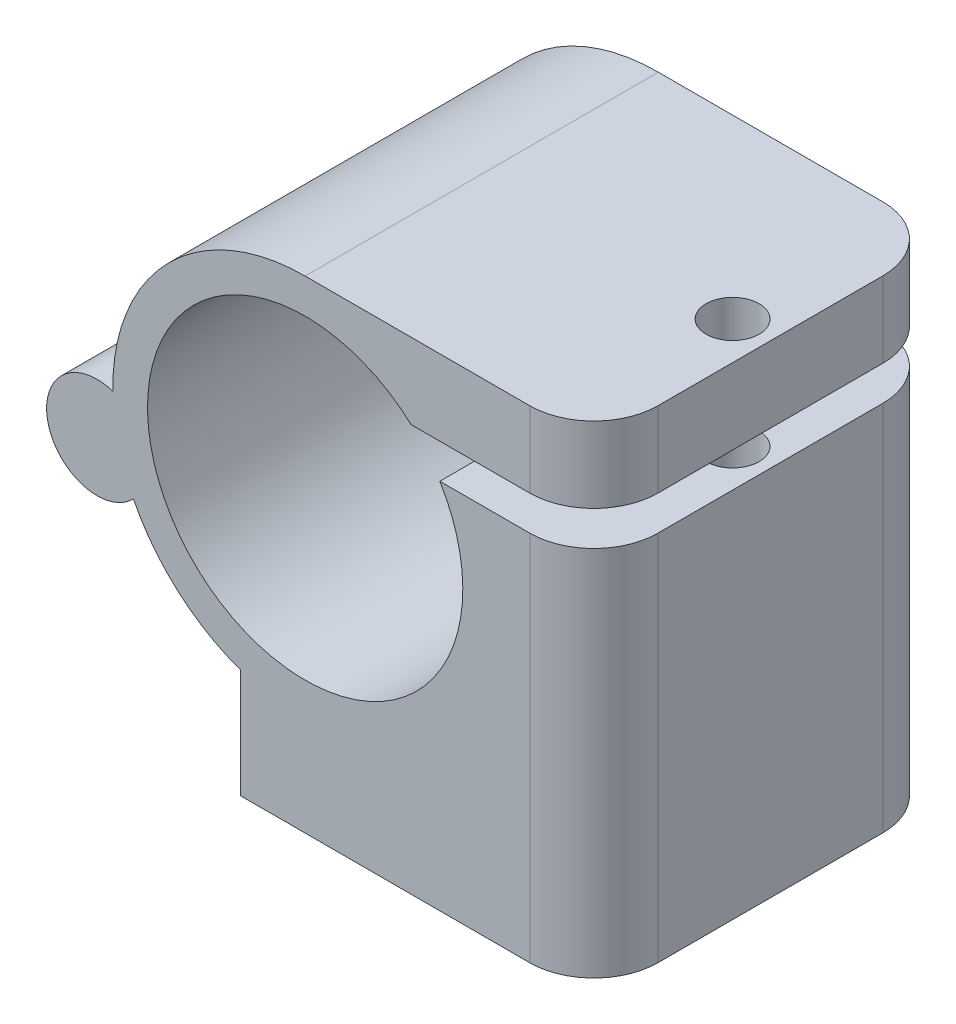
ISO-10303-21;
HEADER;
FILE_DESCRIPTION(('STEP AP214'),'2;1');
FILE_NAME('part.step','',(''),(''),'','','');
FILE_SCHEMA(('AUTOMOTIVE_DESIGN { 1 0 10303 214 1 1 1 1 }'));
ENDSEC;
DATA;
#1=APPLICATION_CONTEXT('core data for automotive mechanical design processes');
#2=APPLICATION_PROTOCOL_DEFINITION('international standard','automotive_design',2000,#1);
#3=PRODUCT_CONTEXT('',#1,'mechanical');
#4=PRODUCT('Part','Part','',(#3));
#5=PRODUCT_RELATED_PRODUCT_CATEGORY('part','',(#4));
#6=PRODUCT_DEFINITION_FORMATION('','',#4);
#7=PRODUCT_DEFINITION_CONTEXT('part definition',#1,'design');
#8=PRODUCT_DEFINITION('design','',#6,#7);
#9=PRODUCT_DEFINITION_SHAPE('','',#8);
#10=(LENGTH_UNIT() NAMED_UNIT(*) SI_UNIT(.MILLI.,.METRE.));
#11=(NAMED_UNIT(*) PLANE_ANGLE_UNIT() SI_UNIT($,.RADIAN.));
#12=(NAMED_UNIT(*) SI_UNIT($,.STERADIAN.) SOLID_ANGLE_UNIT());
#13=UNCERTAINTY_MEASURE_WITH_UNIT(LENGTH_MEASURE(1.E-05),#10,'distance_accuracy_value','');
#14=(GEOMETRIC_REPRESENTATION_CONTEXT(3) GLOBAL_UNCERTAINTY_ASSIGNED_CONTEXT((#13)) GLOBAL_UNIT_ASSIGNED_CONTEXT((#10,
#11,#12)) REPRESENTATION_CONTEXT('',''));
#15=CARTESIAN_POINT('',(0.,0.,0.));
#16=DIRECTION('',(0.,0.,1.));
#17=DIRECTION('',(1.,0.,0.));
#18=AXIS2_PLACEMENT_3D('',#15,#16,#17);
#19=CARTESIAN_POINT('',(8.92,10.5,-8.92));
#20=DIRECTION('',(0.,-1.,0.));
#21=DIRECTION('',(0.,0.,-1.));
#22=AXIS2_PLACEMENT_3D('',#19,#20,#21);
#23=CYLINDRICAL_SURFACE('',#22,5.08);
#24=DIRECTION('',(0.,1.,0.));
#25=VECTOR('',#24,1.);
#26=CARTESIAN_POINT('',(14.,10.5,-8.92));
#27=LINE('',#26,#25);
#28=CARTESIAN_POINT('',(14.,0.,-8.92));
#29=VERTEX_POINT('',#28);
#30=CARTESIAN_POINT('',(14.,29.5,-8.92));
#31=VERTEX_POINT('',#30);
#32=EDGE_CURVE('E356',#29,#31,#27,.T.);
#33=ORIENTED_EDGE('',*,*,#32,.F.);
#34=CARTESIAN_POINT('',(8.92,0.,-8.92));
#35=DIRECTION('',(0.,1.,0.));
#36=DIRECTION('',(0.,0.,1.));
#37=AXIS2_PLACEMENT_3D('',#34,#35,#36);
#38=CIRCLE('',#37,5.08);
#39=CARTESIAN_POINT('',(8.92,0.,-14.));
#40=VERTEX_POINT('',#39);
#41=EDGE_CURVE('E163',#40,#29,#38,.F.);
#42=ORIENTED_EDGE('',*,*,#41,.F.);
#43=DIRECTION('',(0.,1.,0.));
#44=VECTOR('',#43,1.);
#45=CARTESIAN_POINT('',(8.92,10.5,-14.));
#46=LINE('',#45,#44);
#47=CARTESIAN_POINT('',(8.92,29.5,-14.));
#48=VERTEX_POINT('',#47);
#49=EDGE_CURVE('E359',#48,#40,#46,.F.);
#50=ORIENTED_EDGE('',*,*,#49,.F.);
#51=CARTESIAN_POINT('',(8.92,29.5,-8.92));
#52=DIRECTION('',(0.,1.,0.));
#53=DIRECTION('',(-1.,0.,0.));
#54=AXIS2_PLACEMENT_3D('',#51,#52,#53);
#55=CIRCLE('',#54,5.08);
#56=EDGE_CURVE('E12',#31,#48,#55,.T.);
#57=ORIENTED_EDGE('',*,*,#56,.F.);
#58=EDGE_LOOP('',(#33,#42,#50,#57));
#59=FACE_BOUND('',#58,.T.);
#60=ADVANCED_FACE('F156',(#59),#23,.T.);
#61=CARTESIAN_POINT('',(8.92,0.,-8.92));
#62=DIRECTION('',(0.,1.,0.));
#63=DIRECTION('',(0.,0.,1.));
#64=AXIS2_PLACEMENT_3D('',#61,#62,#63);
#65=CYLINDRICAL_SURFACE('',#64,5.08);
#66=CARTESIAN_POINT('',(8.92,32.25,-8.92));
#67=DIRECTION('',(0.,1.,0.));
#68=DIRECTION('',(0.,0.,1.));
#69=AXIS2_PLACEMENT_3D('',#66,#67,#68);
#70=CIRCLE('',#69,5.08);
#71=CARTESIAN_POINT('',(8.92,32.25,-14.));
#72=VERTEX_POINT('',#71);
#73=CARTESIAN_POINT('',(14.,32.25,-8.92));
#74=VERTEX_POINT('',#73);
#75=EDGE_CURVE('E346',#72,#74,#70,.F.);
#76=ORIENTED_EDGE('',*,*,#75,.F.);
#77=DIRECTION('',(0.,1.,0.));
#78=VECTOR('',#77,1.);
#79=CARTESIAN_POINT('',(8.92,10.5,-14.));
#80=LINE('',#79,#78);
#81=CARTESIAN_POINT('',(8.92,38.25,-14.));
#82=VERTEX_POINT('',#81);
#83=EDGE_CURVE('E352',#82,#72,#80,.F.);
#84=ORIENTED_EDGE('',*,*,#83,.F.);
#85=CARTESIAN_POINT('',(8.92,38.25,-8.92));
#86=DIRECTION('',(0.,1.,0.));
#87=DIRECTION('',(0.,0.,1.));
#88=AXIS2_PLACEMENT_3D('',#85,#86,#87);
#89=CIRCLE('',#88,5.08);
#90=CARTESIAN_POINT('',(14.,38.25,-8.92));
#91=VERTEX_POINT('',#90);
#92=EDGE_CURVE('E354',#91,#82,#89,.T.);
#93=ORIENTED_EDGE('',*,*,#92,.F.);
#94=DIRECTION('',(0.,1.,0.));
#95=VECTOR('',#94,1.);
#96=CARTESIAN_POINT('',(14.,0.,-8.92));
#97=LINE('',#96,#95);
#98=EDGE_CURVE('E349',#74,#91,#97,.T.);
#99=ORIENTED_EDGE('',*,*,#98,.F.);
#100=EDGE_LOOP('',(#76,#84,#93,#99));
#101=FACE_BOUND('',#100,.T.);
#102=ADVANCED_FACE('F414',(#101),#65,.T.);
#103=CARTESIAN_POINT('',(8.92,10.5,8.92));
#104=DIRECTION('',(0.,-1.,0.));
#105=DIRECTION('',(0.,0.,-1.));
#106=AXIS2_PLACEMENT_3D('',#103,#104,#105);
#107=CYLINDRICAL_SURFACE('',#106,5.08);
#108=DIRECTION('',(0.,1.,0.));
#109=VECTOR('',#108,1.);
#110=CARTESIAN_POINT('',(8.92,10.5,14.));
#111=LINE('',#110,#109);
#112=CARTESIAN_POINT('',(8.92,32.25,14.));
#113=VERTEX_POINT('',#112);
#114=CARTESIAN_POINT('',(8.92,38.25,14.));
#115=VERTEX_POINT('',#114);
#116=EDGE_CURVE('E268',#113,#115,#111,.T.);
#117=ORIENTED_EDGE('',*,*,#116,.F.);
#118=CARTESIAN_POINT('',(8.92,32.25,8.92));
#119=DIRECTION('',(0.,1.,0.));
#120=DIRECTION('',(0.,0.,1.));
#121=AXIS2_PLACEMENT_3D('',#118,#119,#120);
#122=CIRCLE('',#121,5.08);
#123=CARTESIAN_POINT('',(14.,32.25,8.92));
#124=VERTEX_POINT('',#123);
#125=EDGE_CURVE('E342',#124,#113,#122,.F.);
#126=ORIENTED_EDGE('',*,*,#125,.F.);
#127=DIRECTION('',(0.,1.,0.));
#128=VECTOR('',#127,1.);
#129=CARTESIAN_POINT('',(14.,10.5,8.92));
#130=LINE('',#129,#128);
#131=CARTESIAN_POINT('',(14.,38.25,8.92));
#132=VERTEX_POINT('',#131);
#133=EDGE_CURVE('E339',#132,#124,#130,.F.);
#134=ORIENTED_EDGE('',*,*,#133,.F.);
#135=CARTESIAN_POINT('',(8.92,38.25,8.92));
#136=DIRECTION('',(0.,1.,0.));
#137=DIRECTION('',(0.,0.,1.));
#138=AXIS2_PLACEMENT_3D('',#135,#136,#137);
#139=CIRCLE('',#138,5.08);
#140=EDGE_CURVE('E344',#115,#132,#139,.T.);
#141=ORIENTED_EDGE('',*,*,#140,.F.);
#142=EDGE_LOOP('',(#117,#126,#134,#141));
#143=FACE_BOUND('',#142,.T.);
#144=ADVANCED_FACE('F418',(#143),#107,.T.);
#145=CARTESIAN_POINT('',(8.92,10.5,8.92));
#146=DIRECTION('',(0.,1.,0.));
#147=DIRECTION('',(0.,0.,1.));
#148=AXIS2_PLACEMENT_3D('',#145,#146,#147);
#149=CYLINDRICAL_SURFACE('',#148,5.08);
#150=DIRECTION('',(0.,1.,0.));
#151=VECTOR('',#150,1.);
#152=CARTESIAN_POINT('',(8.92,10.5,14.));
#153=LINE('',#152,#151);
#154=CARTESIAN_POINT('',(8.92,0.,14.));
#155=VERTEX_POINT('',#154);
#156=CARTESIAN_POINT('',(8.92,29.5,14.));
#157=VERTEX_POINT('',#156);
#158=EDGE_CURVE('E327',#155,#157,#153,.T.);
#159=ORIENTED_EDGE('',*,*,#158,.F.);
#160=CARTESIAN_POINT('',(8.92,0.,8.92));
#161=DIRECTION('',(0.,1.,0.));
#162=DIRECTION('',(0.,0.,1.));
#163=AXIS2_PLACEMENT_3D('',#160,#161,#162);
#164=CIRCLE('',#163,5.08);
#165=CARTESIAN_POINT('',(14.,0.,8.92));
#166=VERTEX_POINT('',#165);
#167=EDGE_CURVE('E336',#166,#155,#164,.F.);
#168=ORIENTED_EDGE('',*,*,#167,.F.);
#169=DIRECTION('',(0.,1.,0.));
#170=VECTOR('',#169,1.);
#171=CARTESIAN_POINT('',(14.,10.5,8.92));
#172=LINE('',#171,#170);
#173=CARTESIAN_POINT('',(14.,29.5,8.92));
#174=VERTEX_POINT('',#173);
#175=EDGE_CURVE('E333',#174,#166,#172,.F.);
#176=ORIENTED_EDGE('',*,*,#175,.F.);
#177=CARTESIAN_POINT('',(8.92,29.5,8.92));
#178=DIRECTION('',(0.,1.,0.));
#179=DIRECTION('',(-1.,0.,0.));
#180=AXIS2_PLACEMENT_3D('',#177,#178,#179);
#181=CIRCLE('',#180,5.08);
#182=EDGE_CURVE('E330',#157,#174,#181,.T.);
#183=ORIENTED_EDGE('',*,*,#182,.F.);
#184=EDGE_LOOP('',(#159,#168,#176,#183));
#185=FACE_BOUND('',#184,.T.);
#186=ADVANCED_FACE('F370',(#185),#149,.T.);
#187=CARTESIAN_POINT('',(-8.89,23.,57.1335136523794));
#188=DIRECTION('',(0.,0.,-1.));
#189=DIRECTION('',(-1.,0.,0.));
#190=AXIS2_PLACEMENT_3D('',#187,#188,#189);
#191=CYLINDRICAL_SURFACE('',#190,15.25);
#192=DIRECTION('',(0.,0.,1.));
#193=VECTOR('',#192,1.);
#194=CARTESIAN_POINT('',(-8.89000000000006,38.25,-37.6633070385355));
#195=LINE('',#194,#193);
#196=CARTESIAN_POINT('',(-8.89000000000006,38.25,-14.));
#197=VERTEX_POINT('',#196);
#198=CARTESIAN_POINT('',(-8.89000000000006,38.25,14.));
#199=VERTEX_POINT('',#198);
#200=EDGE_CURVE('E275',#197,#199,#195,.T.);
#201=ORIENTED_EDGE('',*,*,#200,.F.);
#202=CARTESIAN_POINT('',(-8.89,23.,-14.));
#203=DIRECTION('',(0.,0.,-1.));
#204=DIRECTION('',(-1.,0.,0.));
#205=AXIS2_PLACEMENT_3D('',#202,#203,#204);
#206=CIRCLE('',#205,15.25);
#207=CARTESIAN_POINT('',(-24.1372968840955,22.7128802893387,-14.));
#208=VERTEX_POINT('',#207);
#209=EDGE_CURVE('E302',#208,#197,#206,.T.);
#210=ORIENTED_EDGE('',*,*,#209,.F.);
#211=DIRECTION('',(0.,0.,1.));
#212=VECTOR('',#211,1.);
#213=CARTESIAN_POINT('',(-24.1372968840955,22.7128802893387,0.));
#214=LINE('',#213,#212);
#215=CARTESIAN_POINT('',(-24.1372968840955,22.7128802893387,14.));
#216=VERTEX_POINT('',#215);
#217=EDGE_CURVE('E286',#216,#208,#214,.F.);
#218=ORIENTED_EDGE('',*,*,#217,.F.);
#219=CARTESIAN_POINT('',(-8.89,23.,14.));
#220=DIRECTION('',(0.,0.,-1.));
#221=DIRECTION('',(-1.,0.,0.));
#222=AXIS2_PLACEMENT_3D('',#219,#220,#221);
#223=CIRCLE('',#222,15.25);
#224=EDGE_CURVE('E265',#199,#216,#223,.F.);
#225=ORIENTED_EDGE('',*,*,#224,.F.);
#226=EDGE_LOOP('',(#201,#210,#218,#225));
#227=FACE_BOUND('',#226,.T.);
#228=ADVANCED_FACE('F284',(#227),#191,.T.);
#229=CARTESIAN_POINT('',(0.,10.5,14.));
#230=DIRECTION('',(0.,0.,-1.));
#231=DIRECTION('',(-1.,0.,0.));
#232=AXIS2_PLACEMENT_3D('',#229,#230,#231);
#233=PLANE('',#232);
#234=DIRECTION('',(-1.,0.,0.));
#235=VECTOR('',#234,1.);
#236=CARTESIAN_POINT('',(14.,32.25,14.));
#237=LINE('',#236,#235);
#238=CARTESIAN_POINT('',(-0.482414139599879,32.25,14.));
#239=VERTEX_POINT('',#238);
#240=EDGE_CURVE('E282',#113,#239,#237,.T.);
#241=ORIENTED_EDGE('',*,*,#240,.F.);
#242=ORIENTED_EDGE('',*,*,#116,.T.);
#243=DIRECTION('',(-1.,0.,0.));
#244=VECTOR('',#243,1.);
#245=CARTESIAN_POINT('',(0.,38.25,14.));
#246=LINE('',#245,#244);
#247=EDGE_CURVE('E259',#115,#199,#246,.T.);
#248=ORIENTED_EDGE('',*,*,#247,.T.);
#249=ORIENTED_EDGE('',*,*,#224,.T.);
#250=CARTESIAN_POINT('',(-25.3897041705021,18.9140020353069,14.));
#251=DIRECTION('',(0.,0.,1.));
#252=DIRECTION('',(1.,0.,0.));
#253=AXIS2_PLACEMENT_3D('',#250,#251,#252);
#254=CIRCLE('',#253,4.);
#255=CARTESIAN_POINT('',(-22.5092356494731,16.1385919576138,14.));
#256=VERTEX_POINT('',#255);
#257=EDGE_CURVE('E385',#216,#256,#254,.T.);
#258=ORIENTED_EDGE('',*,*,#257,.T.);
#259=CARTESIAN_POINT('',(-14.,8.63161804516598,14.));
#260=VERTEX_POINT('',#259);
#261=EDGE_CURVE('E289',#256,#260,#223,.F.);
#262=ORIENTED_EDGE('',*,*,#261,.T.);
#263=DIRECTION('',(0.,-1.,0.));
#264=VECTOR('',#263,1.);
#265=CARTESIAN_POINT('',(-14.,10.5,14.));
#266=LINE('',#265,#264);
#267=CARTESIAN_POINT('',(-14.,0.,14.));
#268=VERTEX_POINT('',#267);
#269=EDGE_CURVE('E321',#260,#268,#266,.T.);
#270=ORIENTED_EDGE('',*,*,#269,.T.);
#271=DIRECTION('',(1.,0.,0.));
#272=VECTOR('',#271,1.);
#273=CARTESIAN_POINT('',(0.,0.,14.));
#274=LINE('',#273,#272);
#275=EDGE_CURVE('E310',#268,#155,#274,.T.);
#276=ORIENTED_EDGE('',*,*,#275,.T.);
#277=ORIENTED_EDGE('',*,*,#158,.T.);
#278=DIRECTION('',(-1.,0.,0.));
#279=VECTOR('',#278,1.);
#280=CARTESIAN_POINT('',(0.,29.5,14.));
#281=LINE('',#280,#279);
#282=CARTESIAN_POINT('',(1.78707825203131,29.5,14.));
#283=VERTEX_POINT('',#282);
#284=EDGE_CURVE('E374',#157,#283,#281,.T.);
#285=ORIENTED_EDGE('',*,*,#284,.T.);
#286=CARTESIAN_POINT('',(-8.89,23.,14.));
#287=DIRECTION('',(0.,0.,-1.));
#288=DIRECTION('',(-1.,0.,0.));
#289=AXIS2_PLACEMENT_3D('',#286,#287,#288);
#290=CIRCLE('',#289,12.5);
#291=EDGE_CURVE('E288',#239,#283,#290,.F.);
#292=ORIENTED_EDGE('',*,*,#291,.F.);
#293=EDGE_LOOP('',(#241,#242,#248,#249,#258,#262,#270,#276,#277,#285,#292));
#294=FACE_BOUND('',#293,.T.);
#295=ADVANCED_FACE('F262',(#294),#233,.F.);
#296=CARTESIAN_POINT('',(14.,10.5,0.));
#297=DIRECTION('',(-1.,0.,0.));
#298=DIRECTION('',(0.,0.,1.));
#299=AXIS2_PLACEMENT_3D('',#296,#297,#298);
#300=PLANE('',#299);
#301=DIRECTION('',(0.,0.,-1.));
#302=VECTOR('',#301,1.);
#303=CARTESIAN_POINT('',(14.,0.,0.));
#304=LINE('',#303,#302);
#305=EDGE_CURVE('E313',#166,#29,#304,.T.);
#306=ORIENTED_EDGE('',*,*,#305,.T.);
#307=ORIENTED_EDGE('',*,*,#32,.T.);
#308=DIRECTION('',(0.,0.,1.));
#309=VECTOR('',#308,1.);
#310=CARTESIAN_POINT('',(14.,29.5,-37.6927021411862));
#311=LINE('',#310,#309);
#312=EDGE_CURVE('E367',#31,#174,#311,.T.);
#313=ORIENTED_EDGE('',*,*,#312,.T.);
#314=ORIENTED_EDGE('',*,*,#175,.T.);
#315=EDGE_LOOP('',(#306,#307,#313,#314));
#316=FACE_BOUND('',#315,.T.);
#317=ADVANCED_FACE('F365',(#316),#300,.F.);
#318=CARTESIAN_POINT('',(0.,10.5,-14.));
#319=DIRECTION('',(0.,0.,-1.));
#320=DIRECTION('',(-1.,0.,0.));
#321=AXIS2_PLACEMENT_3D('',#318,#319,#320);
#322=PLANE('',#321);
#323=DIRECTION('',(-1.,0.,0.));
#324=VECTOR('',#323,1.);
#325=CARTESIAN_POINT('',(0.,29.5,-14.));
#326=LINE('',#325,#324);
#327=CARTESIAN_POINT('',(1.78707825203131,29.5,-14.));
#328=VERTEX_POINT('',#327);
#329=EDGE_CURVE('E378',#48,#328,#326,.T.);
#330=ORIENTED_EDGE('',*,*,#329,.F.);
#331=ORIENTED_EDGE('',*,*,#49,.T.);
#332=DIRECTION('',(1.,0.,0.));
#333=VECTOR('',#332,1.);
#334=CARTESIAN_POINT('',(0.,0.,-14.));
#335=LINE('',#334,#333);
#336=CARTESIAN_POINT('',(-14.,0.,-14.));
#337=VERTEX_POINT('',#336);
#338=EDGE_CURVE('E316',#337,#40,#335,.T.);
#339=ORIENTED_EDGE('',*,*,#338,.F.);
#340=DIRECTION('',(0.,-1.,0.));
#341=VECTOR('',#340,1.);
#342=CARTESIAN_POINT('',(-14.,10.5,-14.));
#343=LINE('',#342,#341);
#344=CARTESIAN_POINT('',(-14.,8.63161804516598,-14.));
#345=VERTEX_POINT('',#344);
#346=EDGE_CURVE('E319',#345,#337,#343,.T.);
#347=ORIENTED_EDGE('',*,*,#346,.F.);
#348=CARTESIAN_POINT('',(-22.5092356494731,16.1385919576138,-14.));
#349=VERTEX_POINT('',#348);
#350=EDGE_CURVE('E299',#345,#349,#206,.T.);
#351=ORIENTED_EDGE('',*,*,#350,.T.);
#352=CARTESIAN_POINT('',(-25.3897041705021,18.9140020353069,-14.));
#353=DIRECTION('',(0.,0.,-1.));
#354=DIRECTION('',(-1.,0.,0.));
#355=AXIS2_PLACEMENT_3D('',#352,#353,#354);
#356=CIRCLE('',#355,4.);
#357=EDGE_CURVE('E297',#208,#349,#356,.F.);
#358=ORIENTED_EDGE('',*,*,#357,.F.);
#359=ORIENTED_EDGE('',*,*,#209,.T.);
#360=DIRECTION('',(-1.,0.,0.));
#361=VECTOR('',#360,1.);
#362=CARTESIAN_POINT('',(0.,38.25,-14.));
#363=LINE('',#362,#361);
#364=EDGE_CURVE('E279',#82,#197,#363,.T.);
#365=ORIENTED_EDGE('',*,*,#364,.F.);
#366=ORIENTED_EDGE('',*,*,#83,.T.);
#367=DIRECTION('',(-1.,0.,0.));
#368=VECTOR('',#367,1.);
#369=CARTESIAN_POINT('',(14.,32.25,-14.));
#370=LINE('',#369,#368);
#371=CARTESIAN_POINT('',(-0.48241413959988,32.25,-14.));
#372=VERTEX_POINT('',#371);
#373=EDGE_CURVE('E613',#72,#372,#370,.T.);
#374=ORIENTED_EDGE('',*,*,#373,.T.);
#375=CARTESIAN_POINT('',(-8.89,23.,-14.));
#376=DIRECTION('',(0.,0.,-1.));
#377=DIRECTION('',(-1.,0.,0.));
#378=AXIS2_PLACEMENT_3D('',#375,#376,#377);
#379=CIRCLE('',#378,12.5);
#380=EDGE_CURVE('E294',#328,#372,#379,.T.);
#381=ORIENTED_EDGE('',*,*,#380,.F.);
#382=EDGE_LOOP('',(#330,#331,#339,#347,#351,#358,#359,#365,#366,#374,#381));
#383=FACE_BOUND('',#382,.T.);
#384=ADVANCED_FACE('F391',(#383),#322,.T.);
#385=CARTESIAN_POINT('',(-14.,10.5,0.));
#386=DIRECTION('',(-1.,0.,0.));
#387=DIRECTION('',(0.,0.,1.));
#388=AXIS2_PLACEMENT_3D('',#385,#386,#387);
#389=PLANE('',#388);
#390=DIRECTION('',(0.,0.,-1.));
#391=VECTOR('',#390,1.);
#392=CARTESIAN_POINT('',(-14.,8.63161804516598,57.1335136523794));
#393=LINE('',#392,#391);
#394=EDGE_CURVE('E292',#345,#260,#393,.F.);
#395=ORIENTED_EDGE('',*,*,#394,.F.);
#396=ORIENTED_EDGE('',*,*,#346,.T.);
#397=DIRECTION('',(0.,0.,-1.));
#398=VECTOR('',#397,1.);
#399=CARTESIAN_POINT('',(-14.,0.,0.));
#400=LINE('',#399,#398);
#401=EDGE_CURVE('E307',#268,#337,#400,.T.);
#402=ORIENTED_EDGE('',*,*,#401,.F.);
#403=ORIENTED_EDGE('',*,*,#269,.F.);
#404=EDGE_LOOP('',(#395,#396,#402,#403));
#405=FACE_BOUND('',#404,.T.);
#406=ADVANCED_FACE('F399',(#405),#389,.T.);
#407=CARTESIAN_POINT('',(0.,0.,0.));
#408=DIRECTION('',(0.,1.,0.));
#409=DIRECTION('',(0.,0.,1.));
#410=AXIS2_PLACEMENT_3D('',#407,#408,#409);
#411=PLANE('',#410);
#412=CARTESIAN_POINT('',(8.9200000000005,0.,2.55004350968591E-13));
#413=DIRECTION('',(0.,1.,0.));
#414=DIRECTION('',(0.,0.,1.));
#415=AXIS2_PLACEMENT_3D('',#412,#413,#414);
#416=CIRCLE('',#415,4.7625);
#417=CARTESIAN_POINT('',(8.9200000000005,0.,-4.76249999999975));
#418=VERTEX_POINT('',#417);
#419=EDGE_CURVE('E546',#418,#418,#416,.T.);
#420=ORIENTED_EDGE('',*,*,#419,.T.);
#421=EDGE_LOOP('',(#420));
#422=FACE_BOUND('',#421,.T.);
#423=CARTESIAN_POINT('',(2.53269627492614E-13,0.,8.92000000000051));
#424=DIRECTION('',(0.,1.,0.));
#425=DIRECTION('',(0.,0.,1.));
#426=AXIS2_PLACEMENT_3D('',#423,#424,#425);
#427=CIRCLE('',#426,2.54);
#428=CARTESIAN_POINT('',(2.53269627492614E-13,0.,11.4600000000005));
#429=VERTEX_POINT('',#428);
#430=EDGE_CURVE('E558',#429,#429,#427,.T.);
#431=ORIENTED_EDGE('',*,*,#430,.T.);
#432=EDGE_LOOP('',(#431));
#433=FACE_BOUND('',#432,.T.);
#434=CARTESIAN_POINT('',(2.52402265754625E-13,0.,2.55004350968591E-13));
#435=DIRECTION('',(0.,1.,0.));
#436=DIRECTION('',(0.,0.,1.));
#437=AXIS2_PLACEMENT_3D('',#434,#435,#436);
#438=CIRCLE('',#437,2.54);
#439=CARTESIAN_POINT('',(2.52402265754625E-13,0.,2.54000000000025));
#440=VERTEX_POINT('',#439);
#441=EDGE_CURVE('E561',#440,#440,#438,.T.);
#442=ORIENTED_EDGE('',*,*,#441,.T.);
#443=EDGE_LOOP('',(#442));
#444=FACE_BOUND('',#443,.T.);
#445=CARTESIAN_POINT('',(2.51534904016637E-13,0.,-8.92));
#446=DIRECTION('',(0.,1.,0.));
#447=DIRECTION('',(0.,0.,1.));
#448=AXIS2_PLACEMENT_3D('',#445,#446,#447);
#449=CIRCLE('',#448,2.54);
#450=CARTESIAN_POINT('',(2.51534904016637E-13,0.,-6.38));
#451=VERTEX_POINT('',#450);
#452=EDGE_CURVE('E549',#451,#451,#449,.T.);
#453=ORIENTED_EDGE('',*,*,#452,.T.);
#454=EDGE_LOOP('',(#453));
#455=FACE_BOUND('',#454,.T.);
#456=CARTESIAN_POINT('',(8.92000000000051,0.,8.92000000000051));
#457=DIRECTION('',(0.,1.,0.));
#458=DIRECTION('',(0.,0.,1.));
#459=AXIS2_PLACEMENT_3D('',#456,#457,#458);
#460=CIRCLE('',#459,1.52400000000041);
#461=CARTESIAN_POINT('',(8.92000000000051,0.,10.4440000000009));
#462=VERTEX_POINT('',#461);
#463=EDGE_CURVE('E588',#462,#462,#460,.T.);
#464=ORIENTED_EDGE('',*,*,#463,.T.);
#465=EDGE_LOOP('',(#464));
#466=FACE_BOUND('',#465,.T.);
#467=CARTESIAN_POINT('',(8.9200000000005,0.,-8.92));
#468=DIRECTION('',(0.,1.,0.));
#469=DIRECTION('',(0.,0.,1.));
#470=AXIS2_PLACEMENT_3D('',#467,#468,#469);
#471=CIRCLE('',#470,1.52399999999989);
#472=CARTESIAN_POINT('',(8.9200000000005,0.,-7.39600000000011));
#473=VERTEX_POINT('',#472);
#474=EDGE_CURVE('E582',#473,#473,#471,.T.);
#475=ORIENTED_EDGE('',*,*,#474,.T.);
#476=EDGE_LOOP('',(#475));
#477=FACE_BOUND('',#476,.T.);
#478=CARTESIAN_POINT('',(-8.92,0.,-8.92));
#479=DIRECTION('',(0.,1.,0.));
#480=DIRECTION('',(0.,0.,1.));
#481=AXIS2_PLACEMENT_3D('',#478,#479,#480);
#482=CIRCLE('',#481,1.524);
#483=CARTESIAN_POINT('',(-8.92,0.,-7.396));
#484=VERTEX_POINT('',#483);
#485=EDGE_CURVE('E576',#484,#484,#482,.T.);
#486=ORIENTED_EDGE('',*,*,#485,.T.);
#487=EDGE_LOOP('',(#486));
#488=FACE_BOUND('',#487,.T.);
#489=CARTESIAN_POINT('',(-8.92,0.,2.56739074444567E-13));
#490=DIRECTION('',(0.,1.,0.));
#491=DIRECTION('',(0.,0.,1.));
#492=AXIS2_PLACEMENT_3D('',#489,#490,#491);
#493=CIRCLE('',#492,1.0795);
#494=CARTESIAN_POINT('',(-8.92,0.,1.07950000000026));
#495=VERTEX_POINT('',#494);
#496=EDGE_CURVE('E569',#495,#495,#493,.T.);
#497=ORIENTED_EDGE('',*,*,#496,.T.);
#498=EDGE_LOOP('',(#497));
#499=FACE_BOUND('',#498,.T.);
#500=CARTESIAN_POINT('',(-8.92,0.,8.92000000000051));
#501=DIRECTION('',(0.,1.,0.));
#502=DIRECTION('',(0.,0.,1.));
#503=AXIS2_PLACEMENT_3D('',#500,#501,#502);
#504=CIRCLE('',#503,1.5240000000006);
#505=CARTESIAN_POINT('',(-8.92,0.,10.4440000000011));
#506=VERTEX_POINT('',#505);
#507=EDGE_CURVE('E572',#506,#506,#504,.T.);
#508=ORIENTED_EDGE('',*,*,#507,.T.);
#509=EDGE_LOOP('',(#508));
#510=FACE_BOUND('',#509,.T.);
#511=ORIENTED_EDGE('',*,*,#338,.T.);
#512=ORIENTED_EDGE('',*,*,#41,.T.);
#513=ORIENTED_EDGE('',*,*,#305,.F.);
#514=ORIENTED_EDGE('',*,*,#167,.T.);
#515=ORIENTED_EDGE('',*,*,#275,.F.);
#516=ORIENTED_EDGE('',*,*,#401,.T.);
#517=EDGE_LOOP('',(#511,#512,#513,#514,#515,#516));
#518=FACE_BOUND('',#517,.T.);
#519=ADVANCED_FACE('F362',(#422,#433,#444,#455,#466,#477,#488,#499,#510,#518),#411,.F.);
#520=DIRECTION('',(0.,0.,1.));
#521=VECTOR('',#520,1.);
#522=CARTESIAN_POINT('',(-22.5092356494731,16.1385919576138,0.));
#523=LINE('',#522,#521);
#524=EDGE_CURVE('E323',#349,#256,#523,.T.);
#525=ORIENTED_EDGE('',*,*,#524,.F.);
#526=ORIENTED_EDGE('',*,*,#350,.F.);
#527=ORIENTED_EDGE('',*,*,#394,.T.);
#528=ORIENTED_EDGE('',*,*,#261,.F.);
#529=EDGE_LOOP('',(#525,#526,#527,#528));
#530=FACE_BOUND('',#529,.T.);
#531=ADVANCED_FACE('F395',(#530),#191,.T.);
#532=CARTESIAN_POINT('',(-8.89,23.,57.1335136523794));
#533=DIRECTION('',(0.,0.,-1.));
#534=DIRECTION('',(-1.,0.,0.));
#535=AXIS2_PLACEMENT_3D('',#532,#533,#534);
#536=CYLINDRICAL_SURFACE('',#535,12.5);
#537=ORIENTED_EDGE('',*,*,#291,.T.);
#538=DIRECTION('',(0.,0.,1.));
#539=VECTOR('',#538,1.);
#540=CARTESIAN_POINT('',(1.78707825203131,29.5,-14.));
#541=LINE('',#540,#539);
#542=EDGE_CURVE('E376',#328,#283,#541,.T.);
#543=ORIENTED_EDGE('',*,*,#542,.F.);
#544=ORIENTED_EDGE('',*,*,#380,.T.);
#545=DIRECTION('',(0.,0.,1.));
#546=VECTOR('',#545,1.);
#547=CARTESIAN_POINT('',(-0.48241413959988,32.25,-14.));
#548=LINE('',#547,#546);
#549=EDGE_CURVE('E381',#372,#239,#548,.T.);
#550=ORIENTED_EDGE('',*,*,#549,.T.);
#551=EDGE_LOOP('',(#537,#543,#544,#550));
#552=FACE_BOUND('',#551,.T.);
#553=ADVANCED_FACE('F436',(#552),#536,.F.);
#554=CARTESIAN_POINT('',(-25.3897041705021,18.9140020353069,-25.3137084989847));
#555=DIRECTION('',(0.,0.,1.));
#556=DIRECTION('',(1.,0.,0.));
#557=AXIS2_PLACEMENT_3D('',#554,#555,#556);
#558=CYLINDRICAL_SURFACE('',#557,4.);
#559=ORIENTED_EDGE('',*,*,#257,.F.);
#560=ORIENTED_EDGE('',*,*,#217,.T.);
#561=ORIENTED_EDGE('',*,*,#357,.T.);
#562=ORIENTED_EDGE('',*,*,#524,.T.);
#563=EDGE_LOOP('',(#559,#560,#561,#562));
#564=FACE_BOUND('',#563,.T.);
#565=ADVANCED_FACE('F392',(#564),#558,.T.);
#566=CARTESIAN_POINT('',(0.,29.5,-37.6927021411862));
#567=DIRECTION('',(0.,1.,0.));
#568=DIRECTION('',(-1.,0.,0.));
#569=AXIS2_PLACEMENT_3D('',#566,#567,#568);
#570=PLANE('',#569);
#571=CARTESIAN_POINT('',(11.,29.5,0.));
#572=DIRECTION('',(0.,1.,0.));
#573=DIRECTION('',(-1.,0.,0.));
#574=AXIS2_PLACEMENT_3D('',#571,#572,#573);
#575=CIRCLE('',#574,2.1);
#576=CARTESIAN_POINT('',(8.9,29.5,0.));
#577=VERTEX_POINT('',#576);
#578=EDGE_CURVE('E272',#577,#577,#575,.T.);
#579=ORIENTED_EDGE('',*,*,#578,.F.);
#580=EDGE_LOOP('',(#579));
#581=FACE_BOUND('',#580,.T.);
#582=ORIENTED_EDGE('',*,*,#312,.F.);
#583=ORIENTED_EDGE('',*,*,#56,.T.);
#584=ORIENTED_EDGE('',*,*,#329,.T.);
#585=ORIENTED_EDGE('',*,*,#542,.T.);
#586=ORIENTED_EDGE('',*,*,#284,.F.);
#587=ORIENTED_EDGE('',*,*,#182,.T.);
#588=EDGE_LOOP('',(#582,#583,#584,#585,#586,#587));
#589=FACE_BOUND('',#588,.T.);
#590=ADVANCED_FACE('F372',(#581,#589),#570,.T.);
#591=CARTESIAN_POINT('',(14.,32.25,-14.));
#592=DIRECTION('',(0.,1.,0.));
#593=DIRECTION('',(0.,0.,1.));
#594=AXIS2_PLACEMENT_3D('',#591,#592,#593);
#595=PLANE('',#594);
#596=CARTESIAN_POINT('',(11.,32.25,0.));
#597=DIRECTION('',(0.,1.,0.));
#598=DIRECTION('',(0.,0.,1.));
#599=AXIS2_PLACEMENT_3D('',#596,#597,#598);
#600=CIRCLE('',#599,2.1);
#601=CARTESIAN_POINT('',(11.,32.25,2.1));
#602=VERTEX_POINT('',#601);
#603=EDGE_CURVE('E602',#602,#602,#600,.T.);
#604=ORIENTED_EDGE('',*,*,#603,.T.);
#605=EDGE_LOOP('',(#604));
#606=FACE_BOUND('',#605,.T.);
#607=ORIENTED_EDGE('',*,*,#373,.F.);
#608=ORIENTED_EDGE('',*,*,#75,.T.);
#609=DIRECTION('',(0.,0.,1.));
#610=VECTOR('',#609,1.);
#611=CARTESIAN_POINT('',(14.,32.25,-37.6633070385355));
#612=LINE('',#611,#610);
#613=EDGE_CURVE('E271',#74,#124,#612,.T.);
#614=ORIENTED_EDGE('',*,*,#613,.T.);
#615=ORIENTED_EDGE('',*,*,#125,.T.);
#616=ORIENTED_EDGE('',*,*,#240,.T.);
#617=ORIENTED_EDGE('',*,*,#549,.F.);
#618=EDGE_LOOP('',(#607,#608,#614,#615,#616,#617));
#619=FACE_BOUND('',#618,.T.);
#620=ADVANCED_FACE('F448',(#606,#619),#595,.F.);
#621=CARTESIAN_POINT('',(14.,0.,-37.6633070385355));
#622=DIRECTION('',(1.,0.,0.));
#623=DIRECTION('',(0.,0.,-1.));
#624=AXIS2_PLACEMENT_3D('',#621,#622,#623);
#625=PLANE('',#624);
#626=ORIENTED_EDGE('',*,*,#613,.F.);
#627=ORIENTED_EDGE('',*,*,#98,.T.);
#628=DIRECTION('',(0.,0.,1.));
#629=VECTOR('',#628,1.);
#630=CARTESIAN_POINT('',(14.,38.25,-37.6633070385355));
#631=LINE('',#630,#629);
#632=EDGE_CURVE('E609',#91,#132,#631,.T.);
#633=ORIENTED_EDGE('',*,*,#632,.T.);
#634=ORIENTED_EDGE('',*,*,#133,.T.);
#635=EDGE_LOOP('',(#626,#627,#633,#634));
#636=FACE_BOUND('',#635,.T.);
#637=ADVANCED_FACE('F452',(#636),#625,.T.);
#638=CARTESIAN_POINT('',(0.,38.25,-37.6633070385355));
#639=DIRECTION('',(0.,1.,0.));
#640=DIRECTION('',(0.,0.,1.));
#641=AXIS2_PLACEMENT_3D('',#638,#639,#640);
#642=PLANE('',#641);
#643=CARTESIAN_POINT('',(11.,38.25,0.));
#644=DIRECTION('',(0.,1.,0.));
#645=DIRECTION('',(0.,0.,1.));
#646=AXIS2_PLACEMENT_3D('',#643,#644,#645);
#647=CIRCLE('',#646,2.1);
#648=CARTESIAN_POINT('',(11.,38.25,2.1));
#649=VERTEX_POINT('',#648);
#650=EDGE_CURVE('E596',#649,#649,#647,.T.);
#651=ORIENTED_EDGE('',*,*,#650,.F.);
#652=EDGE_LOOP('',(#651));
#653=FACE_BOUND('',#652,.T.);
#654=ORIENTED_EDGE('',*,*,#632,.F.);
#655=ORIENTED_EDGE('',*,*,#92,.T.);
#656=ORIENTED_EDGE('',*,*,#364,.T.);
#657=ORIENTED_EDGE('',*,*,#200,.T.);
#658=ORIENTED_EDGE('',*,*,#247,.F.);
#659=ORIENTED_EDGE('',*,*,#140,.T.);
#660=EDGE_LOOP('',(#654,#655,#656,#657,#658,#659));
#661=FACE_BOUND('',#660,.T.);
#662=ADVANCED_FACE('F277',(#653,#661),#642,.T.);
#663=CARTESIAN_POINT('',(11.,25.5,0.));
#664=DIRECTION('',(0.,1.,0.));
#665=DIRECTION('',(0.,0.,1.));
#666=AXIS2_PLACEMENT_3D('',#663,#664,#665);
#667=CYLINDRICAL_SURFACE('',#666,2.1);
#668=ORIENTED_EDGE('',*,*,#650,.T.);
#669=EDGE_LOOP('',(#668));
#670=FACE_BOUND('',#669,.T.);
#671=ORIENTED_EDGE('',*,*,#603,.F.);
#672=EDGE_LOOP('',(#671));
#673=FACE_BOUND('',#672,.T.);
#674=ADVANCED_FACE('F459',(#670,#673),#667,.F.);
#675=ORIENTED_EDGE('',*,*,#578,.T.);
#676=EDGE_LOOP('',(#675));
#677=FACE_BOUND('',#676,.T.);
#678=CARTESIAN_POINT('',(11.,25.5,0.));
#679=DIRECTION('',(0.,1.,0.));
#680=DIRECTION('',(0.,0.,1.));
#681=AXIS2_PLACEMENT_3D('',#678,#679,#680);
#682=CIRCLE('',#681,2.1);
#683=CARTESIAN_POINT('',(11.,25.5,2.1));
#684=VERTEX_POINT('',#683);
#685=EDGE_CURVE('E599',#684,#684,#682,.T.);
#686=ORIENTED_EDGE('',*,*,#685,.F.);
#687=EDGE_LOOP('',(#686));
#688=FACE_BOUND('',#687,.T.);
#689=ADVANCED_FACE('F461',(#677,#688),#667,.F.);
#690=CARTESIAN_POINT('',(0.,25.5,0.));
#691=DIRECTION('',(0.,1.,0.));
#692=DIRECTION('',(0.,0.,1.));
#693=AXIS2_PLACEMENT_3D('',#690,#691,#692);
#694=PLANE('',#693);
#695=ORIENTED_EDGE('',*,*,#685,.T.);
#696=EDGE_LOOP('',(#695));
#697=FACE_BOUND('',#696,.T.);
#698=ADVANCED_FACE('F464',(#697),#694,.T.);
#699=CARTESIAN_POINT('',(-8.92,5.2,8.92000000000051));
#700=DIRECTION('',(0.,-1.,0.));
#701=DIRECTION('',(0.,0.,-1.));
#702=AXIS2_PLACEMENT_3D('',#699,#700,#701);
#703=CYLINDRICAL_SURFACE('',#702,1.5240000000006);
#704=CARTESIAN_POINT('',(-8.92,5.2,8.92000000000051));
#705=DIRECTION('',(0.,1.,0.));
#706=DIRECTION('',(0.,0.,1.));
#707=AXIS2_PLACEMENT_3D('',#704,#705,#706);
#708=CIRCLE('',#707,1.5240000000006);
#709=CARTESIAN_POINT('',(-8.92,5.2,10.4440000000011));
#710=VERTEX_POINT('',#709);
#711=EDGE_CURVE('E593',#710,#710,#708,.T.);
#712=ORIENTED_EDGE('',*,*,#711,.T.);
#713=EDGE_LOOP('',(#712));
#714=FACE_BOUND('',#713,.T.);
#715=ORIENTED_EDGE('',*,*,#507,.F.);
#716=EDGE_LOOP('',(#715));
#717=FACE_BOUND('',#716,.T.);
#718=ADVANCED_FACE('F468',(#714,#717),#703,.F.);
#719=CARTESIAN_POINT('',(-8.92,5.2,8.92000000000051));
#720=DIRECTION('',(0.,1.,0.));
#721=DIRECTION('',(0.,0.,1.));
#722=AXIS2_PLACEMENT_3D('',#719,#720,#721);
#723=PLANE('',#722);
#724=ORIENTED_EDGE('',*,*,#711,.F.);
#725=EDGE_LOOP('',(#724));
#726=FACE_BOUND('',#725,.T.);
#727=ADVANCED_FACE('F472',(#726),#723,.F.);
#728=CARTESIAN_POINT('',(-8.92,5.2,2.56739074444567E-13));
#729=DIRECTION('',(0.,-1.,0.));
#730=DIRECTION('',(0.,0.,-1.));
#731=AXIS2_PLACEMENT_3D('',#728,#729,#730);
#732=CYLINDRICAL_SURFACE('',#731,1.0795);
#733=CARTESIAN_POINT('',(-8.92,5.2,2.56739074444567E-13));
#734=DIRECTION('',(0.,1.,0.));
#735=DIRECTION('',(0.,0.,1.));
#736=AXIS2_PLACEMENT_3D('',#733,#734,#735);
#737=CIRCLE('',#736,1.0795);
#738=CARTESIAN_POINT('',(-8.92,5.2,1.07950000000026));
#739=VERTEX_POINT('',#738);
#740=EDGE_CURVE('E573',#739,#739,#737,.T.);
#741=ORIENTED_EDGE('',*,*,#740,.T.);
#742=EDGE_LOOP('',(#741));
#743=FACE_BOUND('',#742,.T.);
#744=ORIENTED_EDGE('',*,*,#496,.F.);
#745=EDGE_LOOP('',(#744));
#746=FACE_BOUND('',#745,.T.);
#747=ADVANCED_FACE('F476',(#743,#746),#732,.F.);
#748=CARTESIAN_POINT('',(-8.92,5.2,2.56739074444567E-13));
#749=DIRECTION('',(0.,1.,0.));
#750=DIRECTION('',(0.,0.,1.));
#751=AXIS2_PLACEMENT_3D('',#748,#749,#750);
#752=PLANE('',#751);
#753=ORIENTED_EDGE('',*,*,#740,.F.);
#754=EDGE_LOOP('',(#753));
#755=FACE_BOUND('',#754,.T.);
#756=ADVANCED_FACE('F502',(#755),#752,.F.);
#757=CARTESIAN_POINT('',(-8.92,5.2,-8.92));
#758=DIRECTION('',(0.,-1.,0.));
#759=DIRECTION('',(0.,0.,-1.));
#760=AXIS2_PLACEMENT_3D('',#757,#758,#759);
#761=CYLINDRICAL_SURFACE('',#760,1.524);
#762=CARTESIAN_POINT('',(-8.92,5.2,-8.92));
#763=DIRECTION('',(0.,1.,0.));
#764=DIRECTION('',(0.,0.,1.));
#765=AXIS2_PLACEMENT_3D('',#762,#763,#764);
#766=CIRCLE('',#765,1.524);
#767=CARTESIAN_POINT('',(-8.92,5.2,-7.396));
#768=VERTEX_POINT('',#767);
#769=EDGE_CURVE('E579',#768,#768,#766,.T.);
#770=ORIENTED_EDGE('',*,*,#769,.T.);
#771=EDGE_LOOP('',(#770));
#772=FACE_BOUND('',#771,.T.);
#773=ORIENTED_EDGE('',*,*,#485,.F.);
#774=EDGE_LOOP('',(#773));
#775=FACE_BOUND('',#774,.T.);
#776=ADVANCED_FACE('F498',(#772,#775),#761,.F.);
#777=CARTESIAN_POINT('',(-8.92,5.2,-8.92));
#778=DIRECTION('',(0.,1.,0.));
#779=DIRECTION('',(0.,0.,1.));
#780=AXIS2_PLACEMENT_3D('',#777,#778,#779);
#781=PLANE('',#780);
#782=ORIENTED_EDGE('',*,*,#769,.F.);
#783=EDGE_LOOP('',(#782));
#784=FACE_BOUND('',#783,.T.);
#785=ADVANCED_FACE('F494',(#784),#781,.F.);
#786=CARTESIAN_POINT('',(8.9200000000005,5.2,-8.92));
#787=DIRECTION('',(0.,-1.,0.));
#788=DIRECTION('',(0.,0.,-1.));
#789=AXIS2_PLACEMENT_3D('',#786,#787,#788);
#790=CYLINDRICAL_SURFACE('',#789,1.52399999999989);
#791=CARTESIAN_POINT('',(8.9200000000005,5.2,-8.92));
#792=DIRECTION('',(0.,1.,0.));
#793=DIRECTION('',(0.,0.,1.));
#794=AXIS2_PLACEMENT_3D('',#791,#792,#793);
#795=CIRCLE('',#794,1.52399999999989);
#796=CARTESIAN_POINT('',(8.9200000000005,5.2,-7.39600000000011));
#797=VERTEX_POINT('',#796);
#798=EDGE_CURVE('E585',#797,#797,#795,.T.);
#799=ORIENTED_EDGE('',*,*,#798,.T.);
#800=EDGE_LOOP('',(#799));
#801=FACE_BOUND('',#800,.T.);
#802=ORIENTED_EDGE('',*,*,#474,.F.);
#803=EDGE_LOOP('',(#802));
#804=FACE_BOUND('',#803,.T.);
#805=ADVANCED_FACE('F490',(#801,#804),#790,.F.);
#806=CARTESIAN_POINT('',(8.9200000000005,5.2,-8.92));
#807=DIRECTION('',(0.,1.,0.));
#808=DIRECTION('',(0.,0.,1.));
#809=AXIS2_PLACEMENT_3D('',#806,#807,#808);
#810=PLANE('',#809);
#811=ORIENTED_EDGE('',*,*,#798,.F.);
#812=EDGE_LOOP('',(#811));
#813=FACE_BOUND('',#812,.T.);
#814=ADVANCED_FACE('F486',(#813),#810,.F.);
#815=CARTESIAN_POINT('',(8.92000000000051,5.2,8.92000000000051));
#816=DIRECTION('',(0.,-1.,0.));
#817=DIRECTION('',(0.,0.,-1.));
#818=AXIS2_PLACEMENT_3D('',#815,#816,#817);
#819=CYLINDRICAL_SURFACE('',#818,1.52400000000041);
#820=CARTESIAN_POINT('',(8.92000000000051,5.2,8.92000000000051));
#821=DIRECTION('',(0.,1.,0.));
#822=DIRECTION('',(0.,0.,1.));
#823=AXIS2_PLACEMENT_3D('',#820,#821,#822);
#824=CIRCLE('',#823,1.52400000000041);
#825=CARTESIAN_POINT('',(8.92000000000051,5.2,10.4440000000009));
#826=VERTEX_POINT('',#825);
#827=EDGE_CURVE('E557',#826,#826,#824,.T.);
#828=ORIENTED_EDGE('',*,*,#827,.T.);
#829=EDGE_LOOP('',(#828));
#830=FACE_BOUND('',#829,.T.);
#831=ORIENTED_EDGE('',*,*,#463,.F.);
#832=EDGE_LOOP('',(#831));
#833=FACE_BOUND('',#832,.T.);
#834=ADVANCED_FACE('F482',(#830,#833),#819,.F.);
#835=CARTESIAN_POINT('',(8.92000000000051,5.2,8.92000000000051));
#836=DIRECTION('',(0.,1.,0.));
#837=DIRECTION('',(0.,0.,1.));
#838=AXIS2_PLACEMENT_3D('',#835,#836,#837);
#839=PLANE('',#838);
#840=ORIENTED_EDGE('',*,*,#827,.F.);
#841=EDGE_LOOP('',(#840));
#842=FACE_BOUND('',#841,.T.);
#843=ADVANCED_FACE('F478',(#842),#839,.F.);
#844=CARTESIAN_POINT('',(2.51534904016637E-13,9.5,-8.92));
#845=DIRECTION('',(0.,-1.,0.));
#846=DIRECTION('',(0.,0.,-1.));
#847=AXIS2_PLACEMENT_3D('',#844,#845,#846);
#848=CYLINDRICAL_SURFACE('',#847,2.54);
#849=CARTESIAN_POINT('',(2.51534904016637E-13,9.5,-8.92));
#850=DIRECTION('',(0.,1.,0.));
#851=DIRECTION('',(0.,0.,1.));
#852=AXIS2_PLACEMENT_3D('',#849,#850,#851);
#853=CIRCLE('',#852,2.54);
#854=CARTESIAN_POINT('',(2.51534904016637E-13,9.5,-6.38));
#855=VERTEX_POINT('',#854);
#856=EDGE_CURVE('E545',#855,#855,#853,.T.);
#857=ORIENTED_EDGE('',*,*,#856,.T.);
#858=EDGE_LOOP('',(#857));
#859=FACE_BOUND('',#858,.T.);
#860=ORIENTED_EDGE('',*,*,#452,.F.);
#861=EDGE_LOOP('',(#860));
#862=FACE_BOUND('',#861,.T.);
#863=ADVANCED_FACE('F481',(#859,#862),#848,.F.);
#864=CARTESIAN_POINT('',(2.51534904016637E-13,9.5,-8.92));
#865=DIRECTION('',(0.,1.,0.));
#866=DIRECTION('',(0.,0.,1.));
#867=AXIS2_PLACEMENT_3D('',#864,#865,#866);
#868=PLANE('',#867);
#869=ORIENTED_EDGE('',*,*,#856,.F.);
#870=EDGE_LOOP('',(#869));
#871=FACE_BOUND('',#870,.T.);
#872=ADVANCED_FACE('F510',(#871),#868,.F.);
#873=CARTESIAN_POINT('',(2.52402265754625E-13,9.5,2.55004350968591E-13));
#874=DIRECTION('',(0.,-1.,0.));
#875=DIRECTION('',(0.,0.,-1.));
#876=AXIS2_PLACEMENT_3D('',#873,#874,#875);
#877=CYLINDRICAL_SURFACE('',#876,2.54);
#878=CARTESIAN_POINT('',(2.52402265754625E-13,9.5,2.55004350968591E-13));
#879=DIRECTION('',(0.,1.,0.));
#880=DIRECTION('',(0.,0.,1.));
#881=AXIS2_PLACEMENT_3D('',#878,#879,#880);
#882=CIRCLE('',#881,2.54);
#883=CARTESIAN_POINT('',(2.52402265754625E-13,9.5,2.54000000000025));
#884=VERTEX_POINT('',#883);
#885=EDGE_CURVE('E564',#884,#884,#882,.T.);
#886=ORIENTED_EDGE('',*,*,#885,.T.);
#887=EDGE_LOOP('',(#886));
#888=FACE_BOUND('',#887,.T.);
#889=ORIENTED_EDGE('',*,*,#441,.F.);
#890=EDGE_LOOP('',(#889));
#891=FACE_BOUND('',#890,.T.);
#892=ADVANCED_FACE('F513',(#888,#891),#877,.F.);
#893=CARTESIAN_POINT('',(2.52402265754625E-13,9.5,2.55004350968591E-13));
#894=DIRECTION('',(0.,1.,0.));
#895=DIRECTION('',(0.,0.,1.));
#896=AXIS2_PLACEMENT_3D('',#893,#894,#895);
#897=PLANE('',#896);
#898=ORIENTED_EDGE('',*,*,#885,.F.);
#899=EDGE_LOOP('',(#898));
#900=FACE_BOUND('',#899,.T.);
#901=ADVANCED_FACE('F518',(#900),#897,.F.);
#902=CARTESIAN_POINT('',(2.53269627492614E-13,9.5,8.92000000000051));
#903=DIRECTION('',(0.,-1.,0.));
#904=DIRECTION('',(0.,0.,-1.));
#905=AXIS2_PLACEMENT_3D('',#902,#903,#904);
#906=CYLINDRICAL_SURFACE('',#905,2.54);
#907=CARTESIAN_POINT('',(2.53269627492614E-13,9.5,8.92000000000051));
#908=DIRECTION('',(0.,1.,0.));
#909=DIRECTION('',(0.,0.,1.));
#910=AXIS2_PLACEMENT_3D('',#907,#908,#909);
#911=CIRCLE('',#910,2.54);
#912=CARTESIAN_POINT('',(2.53269627492614E-13,9.5,11.4600000000005));
#913=VERTEX_POINT('',#912);
#914=EDGE_CURVE('E554',#913,#913,#911,.T.);
#915=ORIENTED_EDGE('',*,*,#914,.T.);
#916=EDGE_LOOP('',(#915));
#917=FACE_BOUND('',#916,.T.);
#918=ORIENTED_EDGE('',*,*,#430,.F.);
#919=EDGE_LOOP('',(#918));
#920=FACE_BOUND('',#919,.T.);
#921=ADVANCED_FACE('F521',(#917,#920),#906,.F.);
#922=CARTESIAN_POINT('',(2.53269627492614E-13,9.5,8.92000000000051));
#923=DIRECTION('',(0.,1.,0.));
#924=DIRECTION('',(0.,0.,1.));
#925=AXIS2_PLACEMENT_3D('',#922,#923,#924);
#926=PLANE('',#925);
#927=ORIENTED_EDGE('',*,*,#914,.F.);
#928=EDGE_LOOP('',(#927));
#929=FACE_BOUND('',#928,.T.);
#930=ADVANCED_FACE('F528',(#929),#926,.F.);
#931=CARTESIAN_POINT('',(8.9200000000005,14.5,2.55004350968591E-13));
#932=DIRECTION('',(0.,-1.,0.));
#933=DIRECTION('',(0.,0.,-1.));
#934=AXIS2_PLACEMENT_3D('',#931,#932,#933);
#935=CYLINDRICAL_SURFACE('',#934,4.7625);
#936=CARTESIAN_POINT('',(8.9200000000005,14.5,2.55004350968591E-13));
#937=DIRECTION('',(0.,1.,0.));
#938=DIRECTION('',(0.,0.,1.));
#939=AXIS2_PLACEMENT_3D('',#936,#937,#938);
#940=CIRCLE('',#939,4.7625);
#941=CARTESIAN_POINT('',(8.9200000000005,14.5,-4.76249999999975));
#942=VERTEX_POINT('',#941);
#943=EDGE_CURVE('E544',#942,#942,#940,.T.);
#944=CARTESIAN_POINT('',(8.9200000000005,14.5,-4.76249999999975));
#945=CARTESIAN_POINT('',(8.9200000000005,14.3489583333333,-4.76249999999975));
#946=CARTESIAN_POINT('',(8.9200000000005,14.1979166666667,-4.76249999999975));
#947=CARTESIAN_POINT('',(8.9200000000005,13.8958333333333,-4.76249999999975));
#948=CARTESIAN_POINT('',(8.9200000000005,13.7447916666667,-4.76249999999975));
#949=CARTESIAN_POINT('',(8.9200000000005,13.4427083333333,-4.76249999999975));
#950=CARTESIAN_POINT('',(8.9200000000005,13.2916666666667,-4.76249999999975));
#951=CARTESIAN_POINT('',(8.9200000000005,12.9895833333333,-4.76249999999975));
#952=CARTESIAN_POINT('',(8.9200000000005,12.8385416666667,-4.76249999999975));
#953=CARTESIAN_POINT('',(8.9200000000005,12.5364583333333,-4.76249999999975));
#954=CARTESIAN_POINT('',(8.9200000000005,12.3854166666667,-4.76249999999975));
#955=CARTESIAN_POINT('',(8.9200000000005,12.0833333333333,-4.76249999999975));
#956=CARTESIAN_POINT('',(8.9200000000005,11.9322916666667,-4.76249999999975));
#957=CARTESIAN_POINT('',(8.9200000000005,11.6302083333333,-4.76249999999975));
#958=CARTESIAN_POINT('',(8.9200000000005,11.4791666666667,-4.76249999999975));
#959=CARTESIAN_POINT('',(8.9200000000005,11.1770833333333,-4.76249999999975));
#960=CARTESIAN_POINT('',(8.9200000000005,11.0260416666667,-4.76249999999975));
#961=CARTESIAN_POINT('',(8.9200000000005,10.7239583333333,-4.76249999999975));
#962=CARTESIAN_POINT('',(8.9200000000005,10.5729166666667,-4.76249999999975));
#963=CARTESIAN_POINT('',(8.9200000000005,10.2708333333333,-4.76249999999975));
#964=CARTESIAN_POINT('',(8.9200000000005,10.1197916666667,-4.76249999999975));
#965=CARTESIAN_POINT('',(8.9200000000005,9.81770833333333,-4.76249999999975));
#966=CARTESIAN_POINT('',(8.9200000000005,9.66666666666667,-4.76249999999975));
#967=CARTESIAN_POINT('',(8.9200000000005,9.36458333333333,-4.76249999999975));
#968=CARTESIAN_POINT('',(8.9200000000005,9.21354166666667,-4.76249999999975));
#969=CARTESIAN_POINT('',(8.9200000000005,8.91145833333333,-4.76249999999975));
#970=CARTESIAN_POINT('',(8.9200000000005,8.76041666666667,-4.76249999999975));
#971=CARTESIAN_POINT('',(8.9200000000005,8.45833333333333,-4.76249999999975));
#972=CARTESIAN_POINT('',(8.9200000000005,8.30729166666667,-4.76249999999975));
#973=CARTESIAN_POINT('',(8.9200000000005,8.00520833333333,-4.76249999999975));
#974=CARTESIAN_POINT('',(8.9200000000005,7.85416666666667,-4.76249999999975));
#975=CARTESIAN_POINT('',(8.9200000000005,7.55208333333333,-4.76249999999975));
#976=CARTESIAN_POINT('',(8.9200000000005,7.40104166666667,-4.76249999999975));
#977=CARTESIAN_POINT('',(8.9200000000005,7.09895833333333,-4.76249999999975));
#978=CARTESIAN_POINT('',(8.9200000000005,6.94791666666667,-4.76249999999975));
#979=CARTESIAN_POINT('',(8.9200000000005,6.64583333333333,-4.76249999999975));
#980=CARTESIAN_POINT('',(8.9200000000005,6.49479166666667,-4.76249999999975));
#981=CARTESIAN_POINT('',(8.9200000000005,6.19270833333333,-4.76249999999975));
#982=CARTESIAN_POINT('',(8.9200000000005,6.04166666666667,-4.76249999999975));
#983=CARTESIAN_POINT('',(8.9200000000005,5.73958333333333,-4.76249999999975));
#984=CARTESIAN_POINT('',(8.9200000000005,5.58854166666667,-4.76249999999975));
#985=CARTESIAN_POINT('',(8.9200000000005,5.28645833333333,-4.76249999999975));
#986=CARTESIAN_POINT('',(8.9200000000005,5.13541666666667,-4.76249999999975));
#987=CARTESIAN_POINT('',(8.9200000000005,4.83333333333333,-4.76249999999975));
#988=CARTESIAN_POINT('',(8.9200000000005,4.68229166666667,-4.76249999999975));
#989=CARTESIAN_POINT('',(8.9200000000005,4.38020833333333,-4.76249999999975));
#990=CARTESIAN_POINT('',(8.9200000000005,4.22916666666667,-4.76249999999975));
#991=CARTESIAN_POINT('',(8.9200000000005,3.92708333333333,-4.76249999999975));
#992=CARTESIAN_POINT('',(8.9200000000005,3.77604166666667,-4.76249999999975));
#993=CARTESIAN_POINT('',(8.9200000000005,3.47395833333333,-4.76249999999975));
#994=CARTESIAN_POINT('',(8.9200000000005,3.32291666666667,-4.76249999999975));
#995=CARTESIAN_POINT('',(8.9200000000005,3.02083333333333,-4.76249999999975));
#996=CARTESIAN_POINT('',(8.9200000000005,2.86979166666667,-4.76249999999975));
#997=CARTESIAN_POINT('',(8.9200000000005,2.56770833333333,-4.76249999999975));
#998=CARTESIAN_POINT('',(8.9200000000005,2.41666666666667,-4.76249999999975));
#999=CARTESIAN_POINT('',(8.9200000000005,2.11458333333333,-4.76249999999975));
#1000=CARTESIAN_POINT('',(8.9200000000005,1.96354166666667,-4.76249999999975));
#1001=CARTESIAN_POINT('',(8.9200000000005,1.66145833333333,-4.76249999999975));
#1002=CARTESIAN_POINT('',(8.9200000000005,1.51041666666667,-4.76249999999975));
#1003=CARTESIAN_POINT('',(8.9200000000005,1.20833333333333,-4.76249999999975));
#1004=CARTESIAN_POINT('',(8.9200000000005,1.05729166666667,-4.76249999999975));
#1005=CARTESIAN_POINT('',(8.9200000000005,0.755208333333334,-4.76249999999975));
#1006=CARTESIAN_POINT('',(8.9200000000005,0.604166666666667,-4.76249999999975));
#1007=CARTESIAN_POINT('',(8.9200000000005,0.302083333333333,-4.76249999999975));
#1008=CARTESIAN_POINT('',(8.9200000000005,0.151041666666667,-4.76249999999975));
#1009=CARTESIAN_POINT('',(8.9200000000005,0.,-4.76249999999975));
#1010=B_SPLINE_CURVE_WITH_KNOTS('',3,(#944,#945,#946,#947,#948,#949,#950,#951,#952,#953,#954,
#955,#956,#957,#958,#959,#960,#961,#962,#963,#964,#965,#966,#967,#968,#969,#970,#971,#972,#973,
#974,#975,#976,#977,#978,#979,#980,#981,#982,#983,#984,#985,#986,#987,#988,#989,#990,#991,#992,
#993,#994,#995,#996,#997,#998,#999,#1000,#1001,#1002,#1003,#1004,#1005,#1006,#1007,#1008,#1009),
.UNSPECIFIED.,.F.,.F.,(4,2,2,2,2,2,2,2,2,2,2,2,2,2,2,2,2,2,2,2,2,2,2,2,2,2,2,2,2,2,2,2,4),(0.,
0.453124999999999,0.906249999999999,1.359375,1.8125,2.265625,2.71875,3.171875,3.625,4.078125,
4.53125,4.984375,5.4375,5.890625,6.34375,6.796875,7.25,7.703125,8.15625,8.609375,9.0625,
9.515625,9.96875,10.421875,10.875,11.328125,11.78125,12.234375,12.6875,13.140625,13.59375,
14.046875,14.5),.UNSPECIFIED.);
#1011=EDGE_CURVE('BSEAM532',#942,#418,#1010,.T.);
#1012=ORIENTED_EDGE('',*,*,#943,.T.);
#1013=ORIENTED_EDGE('',*,*,#419,.F.);
#1014=ORIENTED_EDGE('',*,*,#1011,.T.);
#1015=ORIENTED_EDGE('',*,*,#1011,.F.);
#1016=EDGE_LOOP('',(#1012,#1014,#1013,#1015));
#1017=FACE_BOUND('',#1016,.T.);
#1018=ADVANCED_FACE('F532',(#1017),#935,.F.);
#1019=CARTESIAN_POINT('',(8.9200000000005,14.5,2.55004350968591E-13));
#1020=DIRECTION('',(0.,1.,0.));
#1021=DIRECTION('',(0.,0.,1.));
#1022=AXIS2_PLACEMENT_3D('',#1019,#1020,#1021);
#1023=PLANE('',#1022);
#1024=ORIENTED_EDGE('',*,*,#943,.F.);
#1025=EDGE_LOOP('',(#1024));
#1026=FACE_BOUND('',#1025,.T.);
#1027=ADVANCED_FACE('F536',(#1026),#1023,.F.);
#1028=CLOSED_SHELL('',(#60,#102,#144,#186,#228,#295,#317,#384,#406,#519,#531,#553,#565,#590,
#620,#637,#662,#674,#689,#698,#718,#727,#747,#756,#776,#785,#805,#814,#834,#843,#863,#872,#892,
#901,#921,#930,#1018,#1027));
#1029=MANIFOLD_SOLID_BREP('B2',#1028);
#1030=ADVANCED_BREP_SHAPE_REPRESENTATION('',(#18,#1029),#14);
#1031=SHAPE_DEFINITION_REPRESENTATION(#9,#1030);
ENDSEC;
END-ISO-10303-21;
